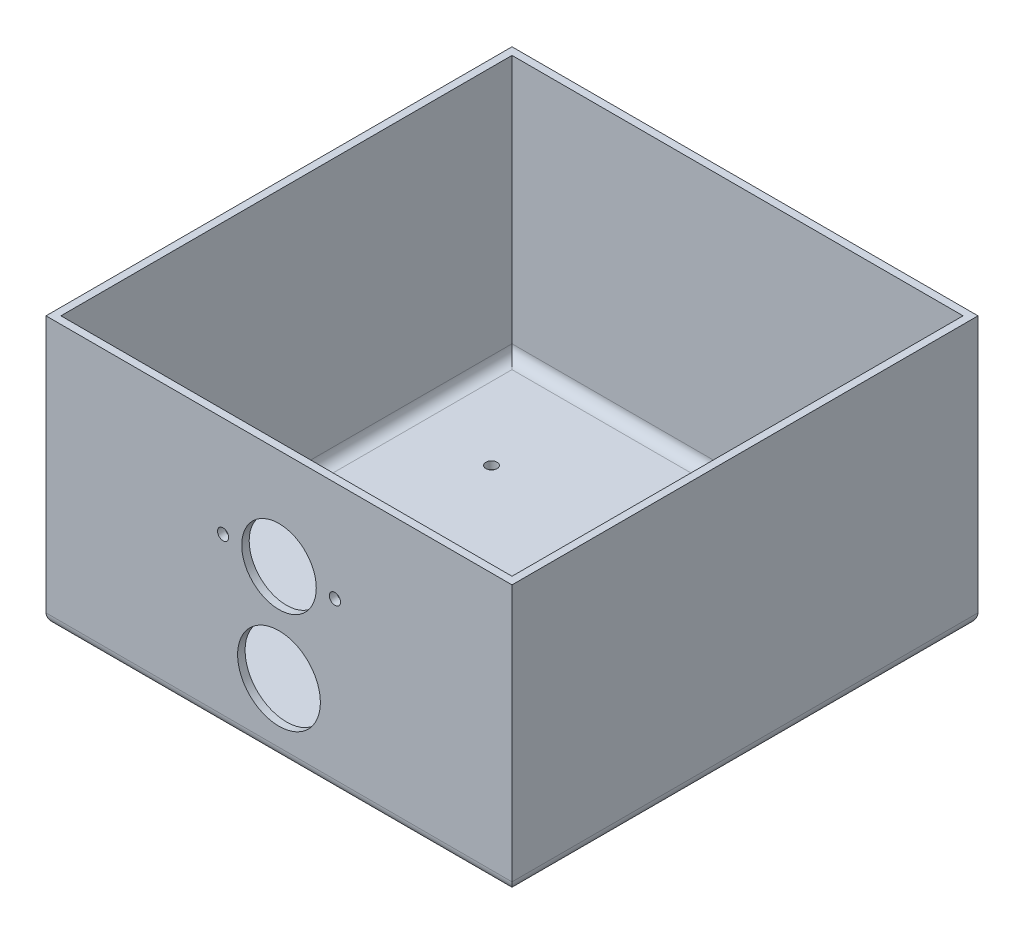
ISO-10303-21;
HEADER;
FILE_DESCRIPTION(('STEP AP214'),'2;1');
FILE_NAME('part.step','',(''),(''),'','','');
FILE_SCHEMA(('AUTOMOTIVE_DESIGN { 1 0 10303 214 1 1 1 1 }'));
ENDSEC;
DATA;
#1=APPLICATION_CONTEXT('core data for automotive mechanical design processes');
#2=APPLICATION_PROTOCOL_DEFINITION('international standard','automotive_design',2000,#1);
#3=PRODUCT_CONTEXT('',#1,'mechanical');
#4=PRODUCT('Part','Part','',(#3));
#5=PRODUCT_RELATED_PRODUCT_CATEGORY('part','',(#4));
#6=PRODUCT_DEFINITION_FORMATION('','',#4);
#7=PRODUCT_DEFINITION_CONTEXT('part definition',#1,'design');
#8=PRODUCT_DEFINITION('design','',#6,#7);
#9=PRODUCT_DEFINITION_SHAPE('','',#8);
#10=(LENGTH_UNIT() NAMED_UNIT(*) SI_UNIT(.MILLI.,.METRE.));
#11=(NAMED_UNIT(*) PLANE_ANGLE_UNIT() SI_UNIT($,.RADIAN.));
#12=(NAMED_UNIT(*) SI_UNIT($,.STERADIAN.) SOLID_ANGLE_UNIT());
#13=UNCERTAINTY_MEASURE_WITH_UNIT(LENGTH_MEASURE(1.E-05),#10,'distance_accuracy_value','');
#14=(GEOMETRIC_REPRESENTATION_CONTEXT(3) GLOBAL_UNCERTAINTY_ASSIGNED_CONTEXT((#13)) GLOBAL_UNIT_ASSIGNED_CONTEXT((#10,
#11,#12)) REPRESENTATION_CONTEXT('',''));
#15=CARTESIAN_POINT('',(0.,0.,0.));
#16=DIRECTION('',(0.,0.,1.));
#17=DIRECTION('',(1.,0.,0.));
#18=AXIS2_PLACEMENT_3D('',#15,#16,#17);
#19=CARTESIAN_POINT('',(0.,70.,0.));
#20=DIRECTION('',(0.,-1.,0.));
#21=DIRECTION('',(0.,0.,-1.));
#22=AXIS2_PLACEMENT_3D('',#19,#20,#21);
#23=PLANE('',#22);
#24=DIRECTION('',(0.,0.,-1.));
#25=VECTOR('',#24,1.);
#26=CARTESIAN_POINT('',(62.5,70.,-62.5));
#27=LINE('',#26,#25);
#28=CARTESIAN_POINT('',(62.5,70.,62.5));
#29=VERTEX_POINT('',#28);
#30=CARTESIAN_POINT('',(62.5,70.,-62.5));
#31=VERTEX_POINT('',#30);
#32=EDGE_CURVE('E141',#29,#31,#27,.T.);
#33=ORIENTED_EDGE('',*,*,#32,.T.);
#34=DIRECTION('',(-1.,0.,0.));
#35=VECTOR('',#34,1.);
#36=CARTESIAN_POINT('',(62.5,70.,-62.5));
#37=LINE('',#36,#35);
#38=CARTESIAN_POINT('',(-62.5,70.,-62.5));
#39=VERTEX_POINT('',#38);
#40=EDGE_CURVE('E159',#31,#39,#37,.T.);
#41=ORIENTED_EDGE('',*,*,#40,.T.);
#42=DIRECTION('',(0.,0.,1.));
#43=VECTOR('',#42,1.);
#44=CARTESIAN_POINT('',(-62.5,70.,-62.5));
#45=LINE('',#44,#43);
#46=CARTESIAN_POINT('',(-62.5,70.,62.5));
#47=VERTEX_POINT('',#46);
#48=EDGE_CURVE('E161',#39,#47,#45,.T.);
#49=ORIENTED_EDGE('',*,*,#48,.T.);
#50=DIRECTION('',(1.,0.,0.));
#51=VECTOR('',#50,1.);
#52=CARTESIAN_POINT('',(62.5,70.,62.5));
#53=LINE('',#52,#51);
#54=EDGE_CURVE('E163',#47,#29,#53,.T.);
#55=ORIENTED_EDGE('',*,*,#54,.T.);
#56=EDGE_LOOP('',(#33,#41,#49,#55));
#57=FACE_BOUND('',#56,.T.);
#58=DIRECTION('',(0.,0.,1.));
#59=VECTOR('',#58,1.);
#60=CARTESIAN_POINT('',(-60.5,70.,-60.5));
#61=LINE('',#60,#59);
#62=CARTESIAN_POINT('',(-60.5,70.,-60.5));
#63=VERTEX_POINT('',#62);
#64=CARTESIAN_POINT('',(-60.5,70.,60.5));
#65=VERTEX_POINT('',#64);
#66=EDGE_CURVE('E125',#63,#65,#61,.T.);
#67=ORIENTED_EDGE('',*,*,#66,.F.);
#68=DIRECTION('',(-1.,0.,0.));
#69=VECTOR('',#68,1.);
#70=CARTESIAN_POINT('',(60.5,70.,-60.5));
#71=LINE('',#70,#69);
#72=CARTESIAN_POINT('',(60.5,70.,-60.5));
#73=VERTEX_POINT('',#72);
#74=EDGE_CURVE('E148',#73,#63,#71,.T.);
#75=ORIENTED_EDGE('',*,*,#74,.F.);
#76=DIRECTION('',(0.,0.,-1.));
#77=VECTOR('',#76,1.);
#78=CARTESIAN_POINT('',(60.5,70.,-60.5));
#79=LINE('',#78,#77);
#80=CARTESIAN_POINT('',(60.5,70.,60.5));
#81=VERTEX_POINT('',#80);
#82=EDGE_CURVE('E146',#81,#73,#79,.T.);
#83=ORIENTED_EDGE('',*,*,#82,.F.);
#84=DIRECTION('',(1.,0.,0.));
#85=VECTOR('',#84,1.);
#86=CARTESIAN_POINT('',(60.5,70.,60.5));
#87=LINE('',#86,#85);
#88=EDGE_CURVE('E135',#65,#81,#87,.T.);
#89=ORIENTED_EDGE('',*,*,#88,.F.);
#90=EDGE_LOOP('',(#67,#75,#83,#89));
#91=FACE_BOUND('',#90,.T.);
#92=ADVANCED_FACE('F33',(#57,#91),#23,.F.);
#93=CARTESIAN_POINT('',(62.5,70.,-62.5));
#94=DIRECTION('',(-1.,0.,0.));
#95=DIRECTION('',(0.,0.,1.));
#96=AXIS2_PLACEMENT_3D('',#93,#94,#95);
#97=PLANE('',#96);
#98=DIRECTION('',(0.,-1.,0.));
#99=VECTOR('',#98,1.);
#100=CARTESIAN_POINT('',(62.5,70.,62.5));
#101=LINE('',#100,#99);
#102=CARTESIAN_POINT('',(62.5,1.,62.5));
#103=VERTEX_POINT('',#102);
#104=EDGE_CURVE('E165',#29,#103,#101,.T.);
#105=ORIENTED_EDGE('',*,*,#104,.T.);
#106=DIRECTION('',(0.,0.,1.));
#107=VECTOR('',#106,1.);
#108=CARTESIAN_POINT('',(62.5,1.,-62.5));
#109=LINE('',#108,#107);
#110=CARTESIAN_POINT('',(62.5,1.,-62.5));
#111=VERTEX_POINT('',#110);
#112=EDGE_CURVE('E191',#103,#111,#109,.F.);
#113=ORIENTED_EDGE('',*,*,#112,.T.);
#114=DIRECTION('',(0.,-1.,0.));
#115=VECTOR('',#114,1.);
#116=CARTESIAN_POINT('',(62.5,70.,-62.5));
#117=LINE('',#116,#115);
#118=EDGE_CURVE('E174',#31,#111,#117,.T.);
#119=ORIENTED_EDGE('',*,*,#118,.F.);
#120=ORIENTED_EDGE('',*,*,#32,.F.);
#121=EDGE_LOOP('',(#105,#113,#119,#120));
#122=FACE_BOUND('',#121,.T.);
#123=ADVANCED_FACE('F254',(#122),#97,.F.);
#124=CARTESIAN_POINT('',(62.5,70.,-62.5));
#125=DIRECTION('',(0.,0.,1.));
#126=DIRECTION('',(1.,0.,0.));
#127=AXIS2_PLACEMENT_3D('',#124,#125,#126);
#128=PLANE('',#127);
#129=ORIENTED_EDGE('',*,*,#118,.T.);
#130=DIRECTION('',(1.,0.,0.));
#131=VECTOR('',#130,1.);
#132=CARTESIAN_POINT('',(-62.5,1.,-62.5));
#133=LINE('',#132,#131);
#134=CARTESIAN_POINT('',(-62.5,1.,-62.5));
#135=VERTEX_POINT('',#134);
#136=EDGE_CURVE('E189',#111,#135,#133,.F.);
#137=ORIENTED_EDGE('',*,*,#136,.T.);
#138=DIRECTION('',(0.,-1.,0.));
#139=VECTOR('',#138,1.);
#140=CARTESIAN_POINT('',(-62.5,70.,-62.5));
#141=LINE('',#140,#139);
#142=EDGE_CURVE('E171',#39,#135,#141,.T.);
#143=ORIENTED_EDGE('',*,*,#142,.F.);
#144=ORIENTED_EDGE('',*,*,#40,.F.);
#145=EDGE_LOOP('',(#129,#137,#143,#144));
#146=FACE_BOUND('',#145,.T.);
#147=ADVANCED_FACE('F260',(#146),#128,.F.);
#148=CARTESIAN_POINT('',(-62.5,70.,-62.5));
#149=DIRECTION('',(1.,0.,0.));
#150=DIRECTION('',(0.,0.,-1.));
#151=AXIS2_PLACEMENT_3D('',#148,#149,#150);
#152=PLANE('',#151);
#153=ORIENTED_EDGE('',*,*,#142,.T.);
#154=DIRECTION('',(0.,0.,-1.));
#155=VECTOR('',#154,1.);
#156=CARTESIAN_POINT('',(-62.5,1.,62.5));
#157=LINE('',#156,#155);
#158=CARTESIAN_POINT('',(-62.5,1.,62.5));
#159=VERTEX_POINT('',#158);
#160=EDGE_CURVE('E186',#135,#159,#157,.F.);
#161=ORIENTED_EDGE('',*,*,#160,.T.);
#162=DIRECTION('',(0.,-1.,0.));
#163=VECTOR('',#162,1.);
#164=CARTESIAN_POINT('',(-62.5,70.,62.5));
#165=LINE('',#164,#163);
#166=EDGE_CURVE('E168',#47,#159,#165,.T.);
#167=ORIENTED_EDGE('',*,*,#166,.F.);
#168=ORIENTED_EDGE('',*,*,#48,.F.);
#169=EDGE_LOOP('',(#153,#161,#167,#168));
#170=FACE_BOUND('',#169,.T.);
#171=ADVANCED_FACE('F268',(#170),#152,.F.);
#172=CARTESIAN_POINT('',(62.5,70.,62.5));
#173=DIRECTION('',(0.,0.,-1.));
#174=DIRECTION('',(-1.,0.,0.));
#175=AXIS2_PLACEMENT_3D('',#172,#173,#174);
#176=PLANE('',#175);
#177=CARTESIAN_POINT('',(15.,43.,62.5));
#178=DIRECTION('',(0.,0.,1.));
#179=DIRECTION('',(-1.,0.,0.));
#180=AXIS2_PLACEMENT_3D('',#177,#178,#179);
#181=CIRCLE('',#180,1.5);
#182=CARTESIAN_POINT('',(13.5,43.,62.5));
#183=VERTEX_POINT('',#182);
#184=EDGE_CURVE('E494',#183,#183,#181,.T.);
#185=ORIENTED_EDGE('',*,*,#184,.F.);
#186=EDGE_LOOP('',(#185));
#187=FACE_BOUND('',#186,.T.);
#188=CARTESIAN_POINT('',(-15.,43.,62.5));
#189=DIRECTION('',(0.,0.,1.));
#190=DIRECTION('',(1.,0.,0.));
#191=AXIS2_PLACEMENT_3D('',#188,#189,#190);
#192=CIRCLE('',#191,1.5);
#193=CARTESIAN_POINT('',(-13.5,43.,62.5));
#194=VERTEX_POINT('',#193);
#195=EDGE_CURVE('E488',#194,#194,#192,.T.);
#196=ORIENTED_EDGE('',*,*,#195,.F.);
#197=EDGE_LOOP('',(#196));
#198=FACE_BOUND('',#197,.T.);
#199=CARTESIAN_POINT('',(0.,43.,62.5));
#200=DIRECTION('',(0.,0.,1.));
#201=DIRECTION('',(1.,0.,0.));
#202=AXIS2_PLACEMENT_3D('',#199,#200,#201);
#203=CIRCLE('',#202,10.);
#204=CARTESIAN_POINT('',(10.,43.,62.5));
#205=VERTEX_POINT('',#204);
#206=EDGE_CURVE('E439',#205,#205,#203,.T.);
#207=ORIENTED_EDGE('',*,*,#206,.F.);
#208=EDGE_LOOP('',(#207));
#209=FACE_BOUND('',#208,.T.);
#210=CARTESIAN_POINT('',(0.,17.,62.5));
#211=DIRECTION('',(0.,0.,1.));
#212=DIRECTION('',(1.,0.,0.));
#213=AXIS2_PLACEMENT_3D('',#210,#211,#212);
#214=CIRCLE('',#213,11.1);
#215=CARTESIAN_POINT('',(11.1,17.,62.5));
#216=VERTEX_POINT('',#215);
#217=EDGE_CURVE('E222',#216,#216,#214,.T.);
#218=ORIENTED_EDGE('',*,*,#217,.F.);
#219=EDGE_LOOP('',(#218));
#220=FACE_BOUND('',#219,.T.);
#221=ORIENTED_EDGE('',*,*,#166,.T.);
#222=DIRECTION('',(-1.,0.,0.));
#223=VECTOR('',#222,1.);
#224=CARTESIAN_POINT('',(62.5,1.,62.5));
#225=LINE('',#224,#223);
#226=EDGE_CURVE('E193',#159,#103,#225,.F.);
#227=ORIENTED_EDGE('',*,*,#226,.T.);
#228=ORIENTED_EDGE('',*,*,#104,.F.);
#229=ORIENTED_EDGE('',*,*,#54,.F.);
#230=EDGE_LOOP('',(#221,#227,#228,#229));
#231=FACE_BOUND('',#230,.T.);
#232=ADVANCED_FACE('F265',(#187,#198,#209,#220,#231),#176,.F.);
#233=CARTESIAN_POINT('',(-60.5,70.,-60.5));
#234=DIRECTION('',(1.,0.,0.));
#235=DIRECTION('',(0.,0.,-1.));
#236=AXIS2_PLACEMENT_3D('',#233,#234,#235);
#237=PLANE('',#236);
#238=DIRECTION('',(0.,-1.,0.));
#239=VECTOR('',#238,1.);
#240=CARTESIAN_POINT('',(-60.5,70.,60.5));
#241=LINE('',#240,#239);
#242=CARTESIAN_POINT('',(-60.5,3.,60.5));
#243=VERTEX_POINT('',#242);
#244=EDGE_CURVE('E129',#65,#243,#241,.T.);
#245=ORIENTED_EDGE('',*,*,#244,.T.);
#246=DIRECTION('',(0.,0.,1.));
#247=VECTOR('',#246,1.);
#248=CARTESIAN_POINT('',(-60.5,3.,-60.5));
#249=LINE('',#248,#247);
#250=CARTESIAN_POINT('',(-60.5,3.,-60.5));
#251=VERTEX_POINT('',#250);
#252=EDGE_CURVE('E215',#243,#251,#249,.F.);
#253=ORIENTED_EDGE('',*,*,#252,.T.);
#254=DIRECTION('',(0.,-1.,0.));
#255=VECTOR('',#254,1.);
#256=CARTESIAN_POINT('',(-60.5,70.,-60.5));
#257=LINE('',#256,#255);
#258=EDGE_CURVE('E131',#63,#251,#257,.T.);
#259=ORIENTED_EDGE('',*,*,#258,.F.);
#260=ORIENTED_EDGE('',*,*,#66,.T.);
#261=EDGE_LOOP('',(#245,#253,#259,#260));
#262=FACE_BOUND('',#261,.T.);
#263=ADVANCED_FACE('F127',(#262),#237,.T.);
#264=CARTESIAN_POINT('',(60.5,70.,60.5));
#265=DIRECTION('',(0.,0.,-1.));
#266=DIRECTION('',(-1.,0.,0.));
#267=AXIS2_PLACEMENT_3D('',#264,#265,#266);
#268=PLANE('',#267);
#269=CARTESIAN_POINT('',(15.,43.,60.5));
#270=DIRECTION('',(0.,0.,-1.));
#271=DIRECTION('',(-1.,0.,0.));
#272=AXIS2_PLACEMENT_3D('',#269,#270,#271);
#273=CIRCLE('',#272,1.5);
#274=CARTESIAN_POINT('',(13.5,43.,60.5));
#275=VERTEX_POINT('',#274);
#276=EDGE_CURVE('E497',#275,#275,#273,.F.);
#277=ORIENTED_EDGE('',*,*,#276,.T.);
#278=EDGE_LOOP('',(#277));
#279=FACE_BOUND('',#278,.T.);
#280=CARTESIAN_POINT('',(-15.,43.,60.5));
#281=DIRECTION('',(0.,0.,-1.));
#282=DIRECTION('',(-1.,0.,0.));
#283=AXIS2_PLACEMENT_3D('',#280,#281,#282);
#284=CIRCLE('',#283,1.5);
#285=CARTESIAN_POINT('',(-16.5,43.,60.5));
#286=VERTEX_POINT('',#285);
#287=EDGE_CURVE('E491',#286,#286,#284,.F.);
#288=ORIENTED_EDGE('',*,*,#287,.T.);
#289=EDGE_LOOP('',(#288));
#290=FACE_BOUND('',#289,.T.);
#291=CARTESIAN_POINT('',(0.,43.,60.5));
#292=DIRECTION('',(0.,0.,-1.));
#293=DIRECTION('',(-1.,0.,0.));
#294=AXIS2_PLACEMENT_3D('',#291,#292,#293);
#295=CIRCLE('',#294,10.);
#296=CARTESIAN_POINT('',(-10.,43.,60.5));
#297=VERTEX_POINT('',#296);
#298=EDGE_CURVE('E485',#297,#297,#295,.F.);
#299=ORIENTED_EDGE('',*,*,#298,.T.);
#300=EDGE_LOOP('',(#299));
#301=FACE_BOUND('',#300,.T.);
#302=CARTESIAN_POINT('',(0.,17.,60.5));
#303=DIRECTION('',(0.,0.,-1.));
#304=DIRECTION('',(-1.,0.,0.));
#305=AXIS2_PLACEMENT_3D('',#302,#303,#304);
#306=CIRCLE('',#305,11.1);
#307=CARTESIAN_POINT('',(-11.1,17.,60.5));
#308=VERTEX_POINT('',#307);
#309=EDGE_CURVE('E434',#308,#308,#306,.F.);
#310=ORIENTED_EDGE('',*,*,#309,.T.);
#311=EDGE_LOOP('',(#310));
#312=FACE_BOUND('',#311,.T.);
#313=DIRECTION('',(0.,-1.,0.));
#314=VECTOR('',#313,1.);
#315=CARTESIAN_POINT('',(60.5,70.,60.5));
#316=LINE('',#315,#314);
#317=CARTESIAN_POINT('',(60.5,3.,60.5));
#318=VERTEX_POINT('',#317);
#319=EDGE_CURVE('E142',#81,#318,#316,.T.);
#320=ORIENTED_EDGE('',*,*,#319,.T.);
#321=DIRECTION('',(1.,0.,0.));
#322=VECTOR('',#321,1.);
#323=CARTESIAN_POINT('',(60.5,3.,60.5));
#324=LINE('',#323,#322);
#325=EDGE_CURVE('E42',#318,#243,#324,.F.);
#326=ORIENTED_EDGE('',*,*,#325,.T.);
#327=ORIENTED_EDGE('',*,*,#244,.F.);
#328=ORIENTED_EDGE('',*,*,#88,.T.);
#329=EDGE_LOOP('',(#320,#326,#327,#328));
#330=FACE_BOUND('',#329,.T.);
#331=ADVANCED_FACE('F139',(#279,#290,#301,#312,#330),#268,.T.);
#332=CARTESIAN_POINT('',(60.5,70.,-60.5));
#333=DIRECTION('',(-1.,0.,0.));
#334=DIRECTION('',(0.,0.,1.));
#335=AXIS2_PLACEMENT_3D('',#332,#333,#334);
#336=PLANE('',#335);
#337=DIRECTION('',(0.,-1.,0.));
#338=VECTOR('',#337,1.);
#339=CARTESIAN_POINT('',(60.5,70.,-60.5));
#340=LINE('',#339,#338);
#341=CARTESIAN_POINT('',(60.5,3.,-60.5));
#342=VERTEX_POINT('',#341);
#343=EDGE_CURVE('E154',#73,#342,#340,.T.);
#344=ORIENTED_EDGE('',*,*,#343,.T.);
#345=DIRECTION('',(0.,0.,-1.));
#346=VECTOR('',#345,1.);
#347=CARTESIAN_POINT('',(60.5,3.,-60.5));
#348=LINE('',#347,#346);
#349=EDGE_CURVE('E11',#342,#318,#348,.F.);
#350=ORIENTED_EDGE('',*,*,#349,.T.);
#351=ORIENTED_EDGE('',*,*,#319,.F.);
#352=ORIENTED_EDGE('',*,*,#82,.T.);
#353=EDGE_LOOP('',(#344,#350,#351,#352));
#354=FACE_BOUND('',#353,.T.);
#355=ADVANCED_FACE('F242',(#354),#336,.T.);
#356=CARTESIAN_POINT('',(60.5,70.,-60.5));
#357=DIRECTION('',(0.,0.,1.));
#358=DIRECTION('',(1.,0.,0.));
#359=AXIS2_PLACEMENT_3D('',#356,#357,#358);
#360=PLANE('',#359);
#361=ORIENTED_EDGE('',*,*,#258,.T.);
#362=DIRECTION('',(-1.,0.,0.));
#363=VECTOR('',#362,1.);
#364=CARTESIAN_POINT('',(60.5,3.,-60.5));
#365=LINE('',#364,#363);
#366=EDGE_CURVE('E56',#251,#342,#365,.F.);
#367=ORIENTED_EDGE('',*,*,#366,.T.);
#368=ORIENTED_EDGE('',*,*,#343,.F.);
#369=ORIENTED_EDGE('',*,*,#74,.T.);
#370=EDGE_LOOP('',(#361,#367,#368,#369));
#371=FACE_BOUND('',#370,.T.);
#372=ADVANCED_FACE('F241',(#371),#360,.T.);
#373=CARTESIAN_POINT('',(0.,0.,0.));
#374=DIRECTION('',(0.,-1.,0.));
#375=DIRECTION('',(0.,0.,-1.));
#376=AXIS2_PLACEMENT_3D('',#373,#374,#375);
#377=PLANE('',#376);
#378=DIRECTION('',(-1.,0.,0.));
#379=VECTOR('',#378,1.);
#380=CARTESIAN_POINT('',(0.,0.,-57.5));
#381=LINE('',#380,#379);
#382=CARTESIAN_POINT('',(57.5,0.,-57.5));
#383=VERTEX_POINT('',#382);
#384=CARTESIAN_POINT('',(-57.5,0.,-57.5));
#385=VERTEX_POINT('',#384);
#386=EDGE_CURVE('E210',#383,#385,#381,.T.);
#387=ORIENTED_EDGE('',*,*,#386,.T.);
#388=DIRECTION('',(0.,0.,1.));
#389=VECTOR('',#388,1.);
#390=CARTESIAN_POINT('',(-57.5,0.,0.));
#391=LINE('',#390,#389);
#392=CARTESIAN_POINT('',(-57.5,0.,57.5));
#393=VERTEX_POINT('',#392);
#394=EDGE_CURVE('E212',#385,#393,#391,.T.);
#395=ORIENTED_EDGE('',*,*,#394,.T.);
#396=DIRECTION('',(1.,0.,0.));
#397=VECTOR('',#396,1.);
#398=CARTESIAN_POINT('',(0.,0.,57.5));
#399=LINE('',#398,#397);
#400=CARTESIAN_POINT('',(57.5,0.,57.5));
#401=VERTEX_POINT('',#400);
#402=EDGE_CURVE('E208',#393,#401,#399,.T.);
#403=ORIENTED_EDGE('',*,*,#402,.T.);
#404=DIRECTION('',(0.,0.,-1.));
#405=VECTOR('',#404,1.);
#406=CARTESIAN_POINT('',(57.5,0.,0.));
#407=LINE('',#406,#405);
#408=EDGE_CURVE('E195',#401,#383,#407,.T.);
#409=ORIENTED_EDGE('',*,*,#408,.T.);
#410=EDGE_LOOP('',(#387,#395,#403,#409));
#411=FACE_BOUND('',#410,.T.);
#412=CARTESIAN_POINT('',(-38.,0.,-32.5));
#413=DIRECTION('',(0.,-1.,0.));
#414=DIRECTION('',(0.,0.,-1.));
#415=AXIS2_PLACEMENT_3D('',#412,#413,#414);
#416=CIRCLE('',#415,1.5);
#417=CARTESIAN_POINT('',(-38.,0.,-34.));
#418=VERTEX_POINT('',#417);
#419=EDGE_CURVE('E457',#418,#418,#416,.T.);
#420=ORIENTED_EDGE('',*,*,#419,.T.);
#421=EDGE_LOOP('',(#420));
#422=FACE_BOUND('',#421,.T.);
#423=CARTESIAN_POINT('',(38.,0.,32.5));
#424=DIRECTION('',(0.,-1.,0.));
#425=DIRECTION('',(0.,0.,-1.));
#426=AXIS2_PLACEMENT_3D('',#423,#424,#425);
#427=CIRCLE('',#426,1.5);
#428=CARTESIAN_POINT('',(38.,0.,31.));
#429=VERTEX_POINT('',#428);
#430=EDGE_CURVE('E454',#429,#429,#427,.T.);
#431=ORIENTED_EDGE('',*,*,#430,.T.);
#432=EDGE_LOOP('',(#431));
#433=FACE_BOUND('',#432,.T.);
#434=CARTESIAN_POINT('',(-38.,0.,32.5));
#435=DIRECTION('',(0.,-1.,0.));
#436=DIRECTION('',(0.,0.,-1.));
#437=AXIS2_PLACEMENT_3D('',#434,#435,#436);
#438=CIRCLE('',#437,1.5);
#439=CARTESIAN_POINT('',(-38.,0.,31.));
#440=VERTEX_POINT('',#439);
#441=EDGE_CURVE('E446',#440,#440,#438,.T.);
#442=ORIENTED_EDGE('',*,*,#441,.T.);
#443=EDGE_LOOP('',(#442));
#444=FACE_BOUND('',#443,.T.);
#445=CARTESIAN_POINT('',(38.,0.,-32.5));
#446=DIRECTION('',(0.,-1.,0.));
#447=DIRECTION('',(0.,0.,-1.));
#448=AXIS2_PLACEMENT_3D('',#445,#446,#447);
#449=CIRCLE('',#448,1.5);
#450=CARTESIAN_POINT('',(38.,0.,-34.));
#451=VERTEX_POINT('',#450);
#452=EDGE_CURVE('E136',#451,#451,#449,.T.);
#453=ORIENTED_EDGE('',*,*,#452,.T.);
#454=EDGE_LOOP('',(#453));
#455=FACE_BOUND('',#454,.T.);
#456=ADVANCED_FACE('F249',(#411,#422,#433,#444,#455),#377,.F.);
#457=CARTESIAN_POINT('',(0.,-2.,0.));
#458=DIRECTION('',(0.,-1.,0.));
#459=DIRECTION('',(0.,0.,-1.));
#460=AXIS2_PLACEMENT_3D('',#457,#458,#459);
#461=PLANE('',#460);
#462=DIRECTION('',(-1.,0.,0.));
#463=VECTOR('',#462,1.);
#464=CARTESIAN_POINT('',(-62.5,-2.,59.5));
#465=LINE('',#464,#463);
#466=CARTESIAN_POINT('',(59.5,-2.,59.5));
#467=VERTEX_POINT('',#466);
#468=CARTESIAN_POINT('',(-59.5,-2.,59.5));
#469=VERTEX_POINT('',#468);
#470=EDGE_CURVE('E177',#467,#469,#465,.T.);
#471=ORIENTED_EDGE('',*,*,#470,.T.);
#472=DIRECTION('',(0.,0.,-1.));
#473=VECTOR('',#472,1.);
#474=CARTESIAN_POINT('',(-59.5,-2.,-62.5));
#475=LINE('',#474,#473);
#476=CARTESIAN_POINT('',(-59.5,-2.,-59.5));
#477=VERTEX_POINT('',#476);
#478=EDGE_CURVE('E183',#469,#477,#475,.T.);
#479=ORIENTED_EDGE('',*,*,#478,.T.);
#480=DIRECTION('',(1.,0.,0.));
#481=VECTOR('',#480,1.);
#482=CARTESIAN_POINT('',(62.5,-2.,-59.5));
#483=LINE('',#482,#481);
#484=CARTESIAN_POINT('',(59.5,-2.,-59.5));
#485=VERTEX_POINT('',#484);
#486=EDGE_CURVE('E181',#477,#485,#483,.T.);
#487=ORIENTED_EDGE('',*,*,#486,.T.);
#488=DIRECTION('',(0.,0.,1.));
#489=VECTOR('',#488,1.);
#490=CARTESIAN_POINT('',(59.5,-2.,62.5));
#491=LINE('',#490,#489);
#492=EDGE_CURVE('E179',#485,#467,#491,.T.);
#493=ORIENTED_EDGE('',*,*,#492,.T.);
#494=EDGE_LOOP('',(#471,#479,#487,#493));
#495=FACE_BOUND('',#494,.T.);
#496=CARTESIAN_POINT('',(-38.,-2.,-32.5));
#497=DIRECTION('',(0.,-1.,0.));
#498=DIRECTION('',(0.,0.,1.));
#499=AXIS2_PLACEMENT_3D('',#496,#497,#498);
#500=CIRCLE('',#499,1.5);
#501=CARTESIAN_POINT('',(-38.,-2.,-31.));
#502=VERTEX_POINT('',#501);
#503=EDGE_CURVE('E443',#502,#502,#500,.T.);
#504=ORIENTED_EDGE('',*,*,#503,.F.);
#505=EDGE_LOOP('',(#504));
#506=FACE_BOUND('',#505,.T.);
#507=CARTESIAN_POINT('',(38.,-2.,32.5));
#508=DIRECTION('',(0.,-1.,0.));
#509=DIRECTION('',(0.,0.,-1.));
#510=AXIS2_PLACEMENT_3D('',#507,#508,#509);
#511=CIRCLE('',#510,1.5);
#512=CARTESIAN_POINT('',(38.,-2.,31.));
#513=VERTEX_POINT('',#512);
#514=EDGE_CURVE('E447',#513,#513,#511,.T.);
#515=ORIENTED_EDGE('',*,*,#514,.F.);
#516=EDGE_LOOP('',(#515));
#517=FACE_BOUND('',#516,.T.);
#518=CARTESIAN_POINT('',(-38.,-2.,32.5));
#519=DIRECTION('',(0.,-1.,0.));
#520=DIRECTION('',(0.,0.,1.));
#521=AXIS2_PLACEMENT_3D('',#518,#519,#520);
#522=CIRCLE('',#521,1.5);
#523=CARTESIAN_POINT('',(-38.,-2.,34.));
#524=VERTEX_POINT('',#523);
#525=EDGE_CURVE('E206',#524,#524,#522,.T.);
#526=ORIENTED_EDGE('',*,*,#525,.F.);
#527=EDGE_LOOP('',(#526));
#528=FACE_BOUND('',#527,.T.);
#529=CARTESIAN_POINT('',(38.,-2.,-32.5));
#530=DIRECTION('',(0.,-1.,0.));
#531=DIRECTION('',(0.,0.,-1.));
#532=AXIS2_PLACEMENT_3D('',#529,#530,#531);
#533=CIRCLE('',#532,1.5);
#534=CARTESIAN_POINT('',(38.,-2.,-34.));
#535=VERTEX_POINT('',#534);
#536=EDGE_CURVE('E460',#535,#535,#533,.T.);
#537=ORIENTED_EDGE('',*,*,#536,.F.);
#538=EDGE_LOOP('',(#537));
#539=FACE_BOUND('',#538,.T.);
#540=ADVANCED_FACE('F353',(#495,#506,#517,#528,#539),#461,.T.);
#541=CARTESIAN_POINT('',(38.,1.,-32.5));
#542=DIRECTION('',(0.,-1.,0.));
#543=DIRECTION('',(0.,0.,-1.));
#544=AXIS2_PLACEMENT_3D('',#541,#542,#543);
#545=CYLINDRICAL_SURFACE('',#544,1.5);
#546=ORIENTED_EDGE('',*,*,#536,.T.);
#547=EDGE_LOOP('',(#546));
#548=FACE_BOUND('',#547,.T.);
#549=ORIENTED_EDGE('',*,*,#452,.F.);
#550=EDGE_LOOP('',(#549));
#551=FACE_BOUND('',#550,.T.);
#552=ADVANCED_FACE('F345',(#548,#551),#545,.F.);
#553=CARTESIAN_POINT('',(-38.,1.,32.5));
#554=DIRECTION('',(0.,-1.,0.));
#555=DIRECTION('',(0.,0.,-1.));
#556=AXIS2_PLACEMENT_3D('',#553,#554,#555);
#557=CYLINDRICAL_SURFACE('',#556,1.5);
#558=ORIENTED_EDGE('',*,*,#525,.T.);
#559=EDGE_LOOP('',(#558));
#560=FACE_BOUND('',#559,.T.);
#561=ORIENTED_EDGE('',*,*,#441,.F.);
#562=EDGE_LOOP('',(#561));
#563=FACE_BOUND('',#562,.T.);
#564=ADVANCED_FACE('F337',(#560,#563),#557,.F.);
#565=CARTESIAN_POINT('',(38.,1.,32.5));
#566=DIRECTION('',(0.,-1.,0.));
#567=DIRECTION('',(0.,0.,-1.));
#568=AXIS2_PLACEMENT_3D('',#565,#566,#567);
#569=CYLINDRICAL_SURFACE('',#568,1.5);
#570=ORIENTED_EDGE('',*,*,#514,.T.);
#571=EDGE_LOOP('',(#570));
#572=FACE_BOUND('',#571,.T.);
#573=ORIENTED_EDGE('',*,*,#430,.F.);
#574=EDGE_LOOP('',(#573));
#575=FACE_BOUND('',#574,.T.);
#576=ADVANCED_FACE('F328',(#572,#575),#569,.F.);
#577=CARTESIAN_POINT('',(-38.,1.,-32.5));
#578=DIRECTION('',(0.,-1.,0.));
#579=DIRECTION('',(0.,0.,-1.));
#580=AXIS2_PLACEMENT_3D('',#577,#578,#579);
#581=CYLINDRICAL_SURFACE('',#580,1.5);
#582=ORIENTED_EDGE('',*,*,#503,.T.);
#583=EDGE_LOOP('',(#582));
#584=FACE_BOUND('',#583,.T.);
#585=ORIENTED_EDGE('',*,*,#419,.F.);
#586=EDGE_LOOP('',(#585));
#587=FACE_BOUND('',#586,.T.);
#588=ADVANCED_FACE('F291',(#584,#587),#581,.F.);
#589=CARTESIAN_POINT('',(59.5,1.,0.));
#590=DIRECTION('',(0.,0.,-1.));
#591=DIRECTION('',(-1.,0.,0.));
#592=AXIS2_PLACEMENT_3D('',#589,#590,#591);
#593=CYLINDRICAL_SURFACE('',#592,3.);
#594=CARTESIAN_POINT('',(59.5,1.,-59.5));
#595=DIRECTION('',(-0.707106781186547,0.,-0.707106781186547));
#596=DIRECTION('',(0.707106781186547,0.,-0.707106781186547));
#597=AXIS2_PLACEMENT_3D('',#594,#595,#596);
#598=ELLIPSE('',#597,4.24264068711928,3.);
#599=EDGE_CURVE('E200',#111,#485,#598,.T.);
#600=ORIENTED_EDGE('',*,*,#599,.F.);
#601=ORIENTED_EDGE('',*,*,#112,.F.);
#602=CARTESIAN_POINT('',(59.5,1.,59.5));
#603=DIRECTION('',(0.707106781186547,0.,-0.707106781186547));
#604=DIRECTION('',(0.707106781186547,0.,0.707106781186547));
#605=AXIS2_PLACEMENT_3D('',#602,#603,#604);
#606=ELLIPSE('',#605,4.24264068711928,3.);
#607=EDGE_CURVE('E203',#467,#103,#606,.F.);
#608=ORIENTED_EDGE('',*,*,#607,.F.);
#609=ORIENTED_EDGE('',*,*,#492,.F.);
#610=EDGE_LOOP('',(#600,#601,#608,#609));
#611=FACE_BOUND('',#610,.T.);
#612=ADVANCED_FACE('F287',(#611),#593,.T.);
#613=CARTESIAN_POINT('',(0.,1.,59.5));
#614=DIRECTION('',(1.,0.,0.));
#615=DIRECTION('',(0.,0.,-1.));
#616=AXIS2_PLACEMENT_3D('',#613,#614,#615);
#617=CYLINDRICAL_SURFACE('',#616,3.);
#618=ORIENTED_EDGE('',*,*,#607,.T.);
#619=ORIENTED_EDGE('',*,*,#226,.F.);
#620=CARTESIAN_POINT('',(-59.5,1.,59.5));
#621=DIRECTION('',(0.707106781186547,0.,0.707106781186547));
#622=DIRECTION('',(0.707106781186547,0.,-0.707106781186547));
#623=AXIS2_PLACEMENT_3D('',#620,#621,#622);
#624=ELLIPSE('',#623,4.24264068711928,3.);
#625=EDGE_CURVE('E198',#469,#159,#624,.F.);
#626=ORIENTED_EDGE('',*,*,#625,.F.);
#627=ORIENTED_EDGE('',*,*,#470,.F.);
#628=EDGE_LOOP('',(#618,#619,#626,#627));
#629=FACE_BOUND('',#628,.T.);
#630=ADVANCED_FACE('F283',(#629),#617,.T.);
#631=CARTESIAN_POINT('',(0.,1.,-59.5));
#632=DIRECTION('',(-1.,0.,0.));
#633=DIRECTION('',(0.,0.,1.));
#634=AXIS2_PLACEMENT_3D('',#631,#632,#633);
#635=CYLINDRICAL_SURFACE('',#634,3.);
#636=ORIENTED_EDGE('',*,*,#599,.T.);
#637=ORIENTED_EDGE('',*,*,#486,.F.);
#638=CARTESIAN_POINT('',(-59.5,1.,-59.5));
#639=DIRECTION('',(-0.707106781186547,0.,0.707106781186547));
#640=DIRECTION('',(-0.707106781186547,0.,-0.707106781186547));
#641=AXIS2_PLACEMENT_3D('',#638,#639,#640);
#642=ELLIPSE('',#641,4.24264068711928,3.);
#643=EDGE_CURVE('E196',#135,#477,#642,.T.);
#644=ORIENTED_EDGE('',*,*,#643,.F.);
#645=ORIENTED_EDGE('',*,*,#136,.F.);
#646=EDGE_LOOP('',(#636,#637,#644,#645));
#647=FACE_BOUND('',#646,.T.);
#648=ADVANCED_FACE('F279',(#647),#635,.T.);
#649=CARTESIAN_POINT('',(-59.5,1.,0.));
#650=DIRECTION('',(0.,0.,1.));
#651=DIRECTION('',(1.,0.,0.));
#652=AXIS2_PLACEMENT_3D('',#649,#650,#651);
#653=CYLINDRICAL_SURFACE('',#652,3.);
#654=ORIENTED_EDGE('',*,*,#625,.T.);
#655=ORIENTED_EDGE('',*,*,#160,.F.);
#656=ORIENTED_EDGE('',*,*,#643,.T.);
#657=ORIENTED_EDGE('',*,*,#478,.F.);
#658=EDGE_LOOP('',(#654,#655,#656,#657));
#659=FACE_BOUND('',#658,.T.);
#660=ADVANCED_FACE('F276',(#659),#653,.T.);
#661=CARTESIAN_POINT('',(57.5,3.,0.));
#662=DIRECTION('',(0.,0.,-1.));
#663=DIRECTION('',(-1.,0.,0.));
#664=AXIS2_PLACEMENT_3D('',#661,#662,#663);
#665=CYLINDRICAL_SURFACE('',#664,3.);
#666=CARTESIAN_POINT('',(57.5,3.,57.5));
#667=DIRECTION('',(0.707106781186547,0.,-0.707106781186548));
#668=DIRECTION('',(0.707106781186548,0.,0.707106781186547));
#669=AXIS2_PLACEMENT_3D('',#666,#667,#668);
#670=ELLIPSE('',#669,4.24264068711929,3.);
#671=EDGE_CURVE('E223',#318,#401,#670,.T.);
#672=ORIENTED_EDGE('',*,*,#671,.F.);
#673=ORIENTED_EDGE('',*,*,#349,.F.);
#674=CARTESIAN_POINT('',(57.5,3.,-57.5));
#675=DIRECTION('',(-0.707106781186548,0.,-0.707106781186547));
#676=DIRECTION('',(-0.707106781186547,0.,0.707106781186548));
#677=AXIS2_PLACEMENT_3D('',#674,#675,#676);
#678=ELLIPSE('',#677,4.24264068711928,3.);
#679=EDGE_CURVE('E37',#383,#342,#678,.F.);
#680=ORIENTED_EDGE('',*,*,#679,.F.);
#681=ORIENTED_EDGE('',*,*,#408,.F.);
#682=EDGE_LOOP('',(#672,#673,#680,#681));
#683=FACE_BOUND('',#682,.T.);
#684=ADVANCED_FACE('F35',(#683),#665,.F.);
#685=CARTESIAN_POINT('',(0.,3.,-57.5));
#686=DIRECTION('',(-1.,0.,0.));
#687=DIRECTION('',(0.,0.,1.));
#688=AXIS2_PLACEMENT_3D('',#685,#686,#687);
#689=CYLINDRICAL_SURFACE('',#688,3.);
#690=ORIENTED_EDGE('',*,*,#679,.T.);
#691=ORIENTED_EDGE('',*,*,#366,.F.);
#692=CARTESIAN_POINT('',(-57.5,3.,-57.5));
#693=DIRECTION('',(-0.707106781186547,0.,0.707106781186548));
#694=DIRECTION('',(0.707106781186548,0.,0.707106781186547));
#695=AXIS2_PLACEMENT_3D('',#692,#693,#694);
#696=ELLIPSE('',#695,4.24264068711929,3.);
#697=EDGE_CURVE('E221',#385,#251,#696,.F.);
#698=ORIENTED_EDGE('',*,*,#697,.F.);
#699=ORIENTED_EDGE('',*,*,#386,.F.);
#700=EDGE_LOOP('',(#690,#691,#698,#699));
#701=FACE_BOUND('',#700,.T.);
#702=ADVANCED_FACE('F232',(#701),#689,.F.);
#703=CARTESIAN_POINT('',(0.,3.,57.5));
#704=DIRECTION('',(1.,0.,0.));
#705=DIRECTION('',(0.,0.,-1.));
#706=AXIS2_PLACEMENT_3D('',#703,#704,#705);
#707=CYLINDRICAL_SURFACE('',#706,3.);
#708=ORIENTED_EDGE('',*,*,#671,.T.);
#709=ORIENTED_EDGE('',*,*,#402,.F.);
#710=CARTESIAN_POINT('',(-57.5,3.,57.5));
#711=DIRECTION('',(0.707106781186548,0.,0.707106781186547));
#712=DIRECTION('',(-0.707106781186547,0.,0.707106781186548));
#713=AXIS2_PLACEMENT_3D('',#710,#711,#712);
#714=ELLIPSE('',#713,4.24264068711928,3.);
#715=EDGE_CURVE('E219',#243,#393,#714,.T.);
#716=ORIENTED_EDGE('',*,*,#715,.F.);
#717=ORIENTED_EDGE('',*,*,#325,.F.);
#718=EDGE_LOOP('',(#708,#709,#716,#717));
#719=FACE_BOUND('',#718,.T.);
#720=ADVANCED_FACE('F237',(#719),#707,.F.);
#721=CARTESIAN_POINT('',(-57.5,3.,0.));
#722=DIRECTION('',(0.,0.,1.));
#723=DIRECTION('',(1.,0.,0.));
#724=AXIS2_PLACEMENT_3D('',#721,#722,#723);
#725=CYLINDRICAL_SURFACE('',#724,3.);
#726=ORIENTED_EDGE('',*,*,#697,.T.);
#727=ORIENTED_EDGE('',*,*,#252,.F.);
#728=ORIENTED_EDGE('',*,*,#715,.T.);
#729=ORIENTED_EDGE('',*,*,#394,.F.);
#730=EDGE_LOOP('',(#726,#727,#728,#729));
#731=FACE_BOUND('',#730,.T.);
#732=ADVANCED_FACE('F240',(#731),#725,.F.);
#733=CARTESIAN_POINT('',(0.,17.,-62.501));
#734=DIRECTION('',(0.,0.,1.));
#735=DIRECTION('',(1.,0.,0.));
#736=AXIS2_PLACEMENT_3D('',#733,#734,#735);
#737=CYLINDRICAL_SURFACE('',#736,11.1);
#738=ORIENTED_EDGE('',*,*,#309,.F.);
#739=EDGE_LOOP('',(#738));
#740=FACE_BOUND('',#739,.T.);
#741=ORIENTED_EDGE('',*,*,#217,.T.);
#742=EDGE_LOOP('',(#741));
#743=FACE_BOUND('',#742,.T.);
#744=ADVANCED_FACE('F295',(#740,#743),#737,.F.);
#745=CARTESIAN_POINT('',(0.,43.,-62.501));
#746=DIRECTION('',(0.,0.,1.));
#747=DIRECTION('',(1.,0.,0.));
#748=AXIS2_PLACEMENT_3D('',#745,#746,#747);
#749=CYLINDRICAL_SURFACE('',#748,10.);
#750=ORIENTED_EDGE('',*,*,#298,.F.);
#751=EDGE_LOOP('',(#750));
#752=FACE_BOUND('',#751,.T.);
#753=ORIENTED_EDGE('',*,*,#206,.T.);
#754=EDGE_LOOP('',(#753));
#755=FACE_BOUND('',#754,.T.);
#756=ADVANCED_FACE('F406',(#752,#755),#749,.F.);
#757=CARTESIAN_POINT('',(-15.,43.,-62.501));
#758=DIRECTION('',(0.,0.,1.));
#759=DIRECTION('',(1.,0.,0.));
#760=AXIS2_PLACEMENT_3D('',#757,#758,#759);
#761=CYLINDRICAL_SURFACE('',#760,1.5);
#762=ORIENTED_EDGE('',*,*,#287,.F.);
#763=EDGE_LOOP('',(#762));
#764=FACE_BOUND('',#763,.T.);
#765=ORIENTED_EDGE('',*,*,#195,.T.);
#766=EDGE_LOOP('',(#765));
#767=FACE_BOUND('',#766,.T.);
#768=ADVANCED_FACE('F400',(#764,#767),#761,.F.);
#769=CARTESIAN_POINT('',(15.,43.,-62.501));
#770=DIRECTION('',(0.,0.,1.));
#771=DIRECTION('',(1.,0.,0.));
#772=AXIS2_PLACEMENT_3D('',#769,#770,#771);
#773=CYLINDRICAL_SURFACE('',#772,1.5);
#774=ORIENTED_EDGE('',*,*,#276,.F.);
#775=EDGE_LOOP('',(#774));
#776=FACE_BOUND('',#775,.T.);
#777=ORIENTED_EDGE('',*,*,#184,.T.);
#778=EDGE_LOOP('',(#777));
#779=FACE_BOUND('',#778,.T.);
#780=ADVANCED_FACE('F405',(#776,#779),#773,.F.);
#781=CLOSED_SHELL('',(#92,#123,#147,#171,#232,#263,#331,#355,#372,#456,#540,#552,#564,#576,#588,
#612,#630,#648,#660,#684,#702,#720,#732,#744,#756,#768,#780));
#782=MANIFOLD_SOLID_BREP('B2',#781);
#783=ADVANCED_BREP_SHAPE_REPRESENTATION('',(#18,#782),#14);
#784=SHAPE_DEFINITION_REPRESENTATION(#9,#783);
ENDSEC;
END-ISO-10303-21;
